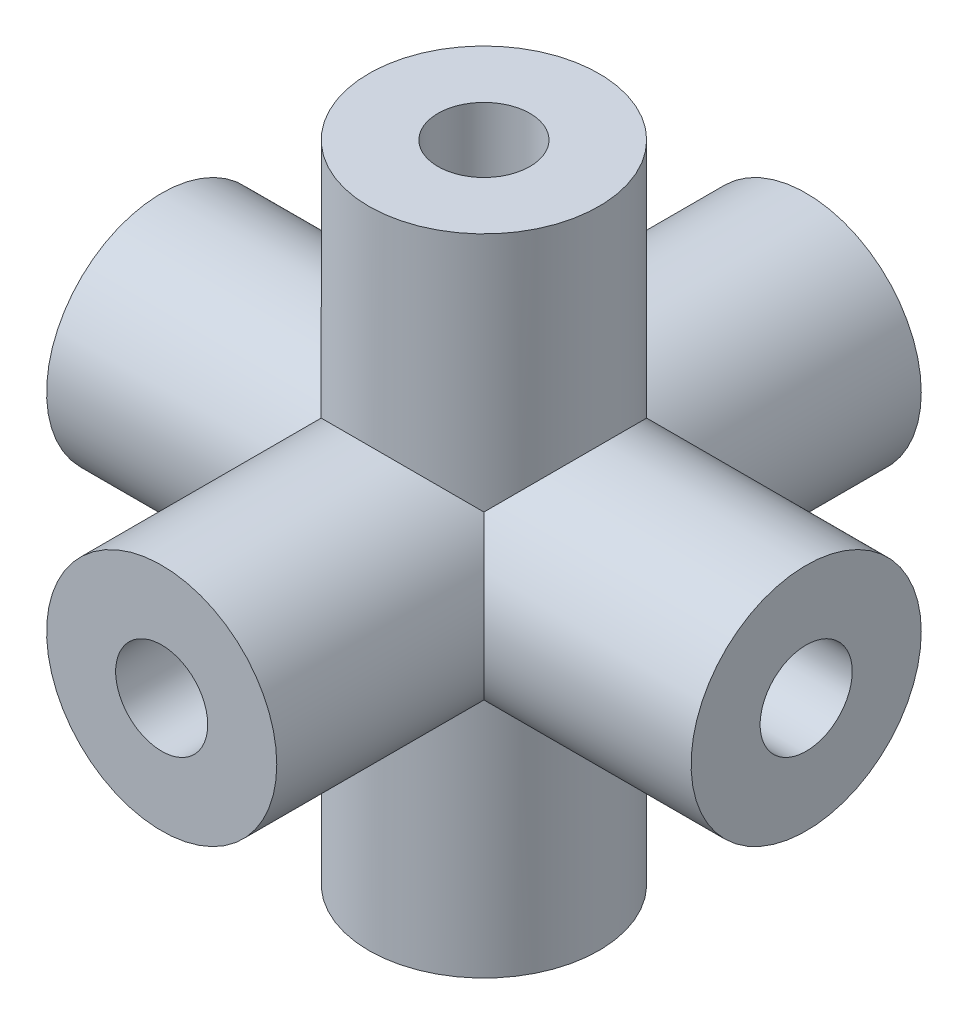
ISO-10303-21;
HEADER;
FILE_DESCRIPTION(('STEP AP214'),'2;1');
FILE_NAME('part.step','',(''),(''),'','','');
FILE_SCHEMA(('AUTOMOTIVE_DESIGN { 1 0 10303 214 1 1 1 1 }'));
ENDSEC;
DATA;
#1=APPLICATION_CONTEXT('core data for automotive mechanical design processes');
#2=APPLICATION_PROTOCOL_DEFINITION('international standard','automotive_design',2000,#1);
#3=PRODUCT_CONTEXT('',#1,'mechanical');
#4=PRODUCT('Part','Part','',(#3));
#5=PRODUCT_RELATED_PRODUCT_CATEGORY('part','',(#4));
#6=PRODUCT_DEFINITION_FORMATION('','',#4);
#7=PRODUCT_DEFINITION_CONTEXT('part definition',#1,'design');
#8=PRODUCT_DEFINITION('design','',#6,#7);
#9=PRODUCT_DEFINITION_SHAPE('','',#8);
#10=(LENGTH_UNIT() NAMED_UNIT(*) SI_UNIT(.MILLI.,.METRE.));
#11=(NAMED_UNIT(*) PLANE_ANGLE_UNIT() SI_UNIT($,.RADIAN.));
#12=(NAMED_UNIT(*) SI_UNIT($,.STERADIAN.) SOLID_ANGLE_UNIT());
#13=UNCERTAINTY_MEASURE_WITH_UNIT(LENGTH_MEASURE(1.E-05),#10,'distance_accuracy_value','');
#14=(GEOMETRIC_REPRESENTATION_CONTEXT(3) GLOBAL_UNCERTAINTY_ASSIGNED_CONTEXT((#13)) GLOBAL_UNIT_ASSIGNED_CONTEXT((#10,
#11,#12)) REPRESENTATION_CONTEXT('',''));
#15=CARTESIAN_POINT('',(0.,0.,0.));
#16=DIRECTION('',(0.,0.,1.));
#17=DIRECTION('',(1.,0.,0.));
#18=AXIS2_PLACEMENT_3D('',#15,#16,#17);
#19=CARTESIAN_POINT('',(0.,0.,7.));
#20=DIRECTION('',(0.,0.,-1.));
#21=DIRECTION('',(-1.,0.,0.));
#22=AXIS2_PLACEMENT_3D('',#19,#20,#21);
#23=CYLINDRICAL_SURFACE('',#22,2.5);
#24=CARTESIAN_POINT('',(0.,0.,7.));
#25=DIRECTION('',(0.,0.,1.));
#26=DIRECTION('',(1.,0.,0.));
#27=AXIS2_PLACEMENT_3D('',#24,#25,#26);
#28=CIRCLE('',#27,2.5);
#29=CARTESIAN_POINT('',(2.5,0.,7.));
#30=VERTEX_POINT('',#29);
#31=EDGE_CURVE('E98',#30,#30,#28,.T.);
#32=ORIENTED_EDGE('',*,*,#31,.F.);
#33=EDGE_LOOP('',(#32));
#34=FACE_BOUND('',#33,.T.);
#35=CARTESIAN_POINT('',(0.,0.,0.));
#36=DIRECTION('',(-0.707106781186547,0.,-0.707106781186547));
#37=DIRECTION('',(0.707106781186547,0.,-0.707106781186547));
#38=AXIS2_PLACEMENT_3D('',#35,#36,#37);
#39=ELLIPSE('',#38,3.53553390593274,2.5);
#40=CARTESIAN_POINT('',(-1.76776695296637,-1.76776695296637,1.76776695296637));
#41=VERTEX_POINT('',#40);
#42=CARTESIAN_POINT('',(-1.76776695296637,1.76776695296637,1.76776695296637));
#43=VERTEX_POINT('',#42);
#44=EDGE_CURVE('E51',#41,#43,#39,.T.);
#45=ORIENTED_EDGE('',*,*,#44,.F.);
#46=CARTESIAN_POINT('',(0.,0.,0.));
#47=DIRECTION('',(0.,-0.707106781186547,-0.707106781186547));
#48=DIRECTION('',(0.,0.707106781186547,-0.707106781186547));
#49=AXIS2_PLACEMENT_3D('',#46,#47,#48);
#50=ELLIPSE('',#49,3.53553390593274,2.5);
#51=CARTESIAN_POINT('',(1.76776695296637,-1.76776695296637,1.76776695296637));
#52=VERTEX_POINT('',#51);
#53=EDGE_CURVE('E82',#52,#41,#50,.T.);
#54=ORIENTED_EDGE('',*,*,#53,.F.);
#55=CARTESIAN_POINT('',(0.,0.,0.));
#56=DIRECTION('',(0.707106781186547,0.,-0.707106781186547));
#57=DIRECTION('',(-0.707106781186547,0.,-0.707106781186547));
#58=AXIS2_PLACEMENT_3D('',#55,#56,#57);
#59=ELLIPSE('',#58,3.53553390593274,2.5);
#60=CARTESIAN_POINT('',(1.76776695296637,1.76776695296637,1.76776695296637));
#61=VERTEX_POINT('',#60);
#62=EDGE_CURVE('E86',#61,#52,#59,.T.);
#63=ORIENTED_EDGE('',*,*,#62,.F.);
#64=CARTESIAN_POINT('',(0.,0.,0.));
#65=DIRECTION('',(0.,0.707106781186547,-0.707106781186547));
#66=DIRECTION('',(0.,-0.707106781186547,-0.707106781186547));
#67=AXIS2_PLACEMENT_3D('',#64,#65,#66);
#68=ELLIPSE('',#67,3.53553390593274,2.5);
#69=EDGE_CURVE('E77',#43,#61,#68,.T.);
#70=ORIENTED_EDGE('',*,*,#69,.F.);
#71=EDGE_LOOP('',(#45,#54,#63,#70));
#72=FACE_BOUND('',#71,.T.);
#73=ADVANCED_FACE('F37',(#34,#72),#23,.T.);
#74=CARTESIAN_POINT('',(0.,7.,0.));
#75=DIRECTION('',(0.,-1.,0.));
#76=DIRECTION('',(0.,0.,-1.));
#77=AXIS2_PLACEMENT_3D('',#74,#75,#76);
#78=CYLINDRICAL_SURFACE('',#77,2.5);
#79=CARTESIAN_POINT('',(0.,-7.,0.));
#80=DIRECTION('',(0.,1.,0.));
#81=DIRECTION('',(0.,0.,1.));
#82=AXIS2_PLACEMENT_3D('',#79,#80,#81);
#83=CIRCLE('',#82,2.5);
#84=CARTESIAN_POINT('',(0.,-7.,2.5));
#85=VERTEX_POINT('',#84);
#86=EDGE_CURVE('E107',#85,#85,#83,.T.);
#87=ORIENTED_EDGE('',*,*,#86,.T.);
#88=EDGE_LOOP('',(#87));
#89=FACE_BOUND('',#88,.T.);
#90=CARTESIAN_POINT('',(0.,0.,0.));
#91=DIRECTION('',(-0.707106781186547,-0.707106781186547,0.));
#92=DIRECTION('',(0.707106781186547,-0.707106781186547,0.));
#93=AXIS2_PLACEMENT_3D('',#90,#91,#92);
#94=ELLIPSE('',#93,3.53553390593274,2.5);
#95=CARTESIAN_POINT('',(1.76776695296637,-1.76776695296637,-1.76776695296637));
#96=VERTEX_POINT('',#95);
#97=EDGE_CURVE('E58',#52,#96,#94,.F.);
#98=ORIENTED_EDGE('',*,*,#97,.F.);
#99=ORIENTED_EDGE('',*,*,#53,.T.);
#100=CARTESIAN_POINT('',(0.,0.,0.));
#101=DIRECTION('',(0.707106781186547,-0.707106781186547,0.));
#102=DIRECTION('',(-0.707106781186547,-0.707106781186547,0.));
#103=AXIS2_PLACEMENT_3D('',#100,#101,#102);
#104=ELLIPSE('',#103,3.53553390593274,2.5);
#105=CARTESIAN_POINT('',(-1.76776695296637,-1.76776695296637,-1.76776695296637));
#106=VERTEX_POINT('',#105);
#107=EDGE_CURVE('E111',#106,#41,#104,.F.);
#108=ORIENTED_EDGE('',*,*,#107,.F.);
#109=CARTESIAN_POINT('',(0.,0.,0.));
#110=DIRECTION('',(0.,0.707106781186547,-0.707106781186547));
#111=DIRECTION('',(0.,-0.707106781186547,-0.707106781186547));
#112=AXIS2_PLACEMENT_3D('',#109,#110,#111);
#113=ELLIPSE('',#112,3.53553390593274,2.5);
#114=EDGE_CURVE('E83',#106,#96,#113,.F.);
#115=ORIENTED_EDGE('',*,*,#114,.T.);
#116=EDGE_LOOP('',(#98,#99,#108,#115));
#117=FACE_BOUND('',#116,.T.);
#118=ADVANCED_FACE('F175',(#89,#117),#78,.T.);
#119=CARTESIAN_POINT('',(0.,0.,-7.));
#120=DIRECTION('',(0.,0.,1.));
#121=DIRECTION('',(1.,0.,0.));
#122=AXIS2_PLACEMENT_3D('',#119,#120,#121);
#123=CIRCLE('',#122,2.5);
#124=CARTESIAN_POINT('',(2.5,0.,-7.));
#125=VERTEX_POINT('',#124);
#126=EDGE_CURVE('E101',#125,#125,#123,.T.);
#127=ORIENTED_EDGE('',*,*,#126,.T.);
#128=EDGE_LOOP('',(#127));
#129=FACE_BOUND('',#128,.T.);
#130=CARTESIAN_POINT('',(0.,0.,0.));
#131=DIRECTION('',(-0.707106781186547,0.,-0.707106781186547));
#132=DIRECTION('',(0.707106781186547,0.,-0.707106781186547));
#133=AXIS2_PLACEMENT_3D('',#130,#131,#132);
#134=ELLIPSE('',#133,3.53553390593274,2.5);
#135=CARTESIAN_POINT('',(1.76776695296637,1.76776695296637,-1.76776695296637));
#136=VERTEX_POINT('',#135);
#137=EDGE_CURVE('E92',#96,#136,#134,.F.);
#138=ORIENTED_EDGE('',*,*,#137,.F.);
#139=ORIENTED_EDGE('',*,*,#114,.F.);
#140=CARTESIAN_POINT('',(0.,0.,0.));
#141=DIRECTION('',(0.707106781186547,0.,-0.707106781186547));
#142=DIRECTION('',(-0.707106781186547,0.,-0.707106781186547));
#143=AXIS2_PLACEMENT_3D('',#140,#141,#142);
#144=ELLIPSE('',#143,3.53553390593274,2.5);
#145=CARTESIAN_POINT('',(-1.76776695296637,1.76776695296637,-1.76776695296637));
#146=VERTEX_POINT('',#145);
#147=EDGE_CURVE('E88',#146,#106,#144,.F.);
#148=ORIENTED_EDGE('',*,*,#147,.F.);
#149=CARTESIAN_POINT('',(0.,0.,0.));
#150=DIRECTION('',(0.,-0.707106781186547,-0.707106781186547));
#151=DIRECTION('',(0.,0.707106781186547,-0.707106781186547));
#152=AXIS2_PLACEMENT_3D('',#149,#150,#151);
#153=ELLIPSE('',#152,3.53553390593274,2.5);
#154=EDGE_CURVE('E93',#136,#146,#153,.F.);
#155=ORIENTED_EDGE('',*,*,#154,.F.);
#156=EDGE_LOOP('',(#138,#139,#148,#155));
#157=FACE_BOUND('',#156,.T.);
#158=ADVANCED_FACE('F173',(#129,#157),#23,.T.);
#159=CARTESIAN_POINT('',(0.,7.,0.));
#160=DIRECTION('',(0.,1.,0.));
#161=DIRECTION('',(0.,0.,1.));
#162=AXIS2_PLACEMENT_3D('',#159,#160,#161);
#163=CIRCLE('',#162,2.5);
#164=CARTESIAN_POINT('',(0.,7.,2.5));
#165=VERTEX_POINT('',#164);
#166=EDGE_CURVE('E104',#165,#165,#163,.T.);
#167=ORIENTED_EDGE('',*,*,#166,.F.);
#168=EDGE_LOOP('',(#167));
#169=FACE_BOUND('',#168,.T.);
#170=CARTESIAN_POINT('',(0.,0.,0.));
#171=DIRECTION('',(-0.707106781186547,-0.707106781186547,0.));
#172=DIRECTION('',(0.707106781186547,-0.707106781186547,0.));
#173=AXIS2_PLACEMENT_3D('',#170,#171,#172);
#174=ELLIPSE('',#173,3.53553390593274,2.5);
#175=EDGE_CURVE('E11',#43,#146,#174,.T.);
#176=ORIENTED_EDGE('',*,*,#175,.F.);
#177=ORIENTED_EDGE('',*,*,#69,.T.);
#178=CARTESIAN_POINT('',(0.,0.,0.));
#179=DIRECTION('',(0.707106781186547,-0.707106781186547,0.));
#180=DIRECTION('',(-0.707106781186547,-0.707106781186547,0.));
#181=AXIS2_PLACEMENT_3D('',#178,#179,#180);
#182=ELLIPSE('',#181,3.53553390593274,2.5);
#183=EDGE_CURVE('E44',#136,#61,#182,.T.);
#184=ORIENTED_EDGE('',*,*,#183,.F.);
#185=ORIENTED_EDGE('',*,*,#154,.T.);
#186=EDGE_LOOP('',(#176,#177,#184,#185));
#187=FACE_BOUND('',#186,.T.);
#188=ADVANCED_FACE('F79',(#169,#187),#78,.T.);
#189=CARTESIAN_POINT('',(0.,0.,7.));
#190=DIRECTION('',(0.,0.,1.));
#191=DIRECTION('',(1.,0.,0.));
#192=AXIS2_PLACEMENT_3D('',#189,#190,#191);
#193=PLANE('',#192);
#194=CARTESIAN_POINT('',(0.,0.,7.));
#195=DIRECTION('',(0.,0.,1.));
#196=DIRECTION('',(1.,0.,0.));
#197=AXIS2_PLACEMENT_3D('',#194,#195,#196);
#198=CIRCLE('',#197,1.);
#199=CARTESIAN_POINT('',(0.999999999999975,0.,7.));
#200=VERTEX_POINT('',#199);
#201=EDGE_CURVE('E133',#200,#200,#198,.T.);
#202=ORIENTED_EDGE('',*,*,#201,.F.);
#203=EDGE_LOOP('',(#202));
#204=FACE_BOUND('',#203,.T.);
#205=ORIENTED_EDGE('',*,*,#31,.T.);
#206=EDGE_LOOP('',(#205));
#207=FACE_BOUND('',#206,.T.);
#208=ADVANCED_FACE('F172',(#204,#207),#193,.T.);
#209=CARTESIAN_POINT('',(0.,-7.,0.));
#210=DIRECTION('',(0.,1.,0.));
#211=DIRECTION('',(0.,0.,1.));
#212=AXIS2_PLACEMENT_3D('',#209,#210,#211);
#213=PLANE('',#212);
#214=CARTESIAN_POINT('',(0.,-7.,0.));
#215=DIRECTION('',(0.,-1.,0.));
#216=DIRECTION('',(0.,0.,-1.));
#217=AXIS2_PLACEMENT_3D('',#214,#215,#216);
#218=CIRCLE('',#217,1.);
#219=CARTESIAN_POINT('',(0.,-6.99999999999999,-1.00000000000007));
#220=VERTEX_POINT('',#219);
#221=EDGE_CURVE('E151',#220,#220,#218,.T.);
#222=ORIENTED_EDGE('',*,*,#221,.F.);
#223=EDGE_LOOP('',(#222));
#224=FACE_BOUND('',#223,.T.);
#225=ORIENTED_EDGE('',*,*,#86,.F.);
#226=EDGE_LOOP('',(#225));
#227=FACE_BOUND('',#226,.T.);
#228=ADVANCED_FACE('F180',(#224,#227),#213,.F.);
#229=CARTESIAN_POINT('',(0.,0.,-7.));
#230=DIRECTION('',(0.,0.,1.));
#231=DIRECTION('',(1.,0.,0.));
#232=AXIS2_PLACEMENT_3D('',#229,#230,#231);
#233=PLANE('',#232);
#234=CARTESIAN_POINT('',(0.,0.,-7.));
#235=DIRECTION('',(0.,0.,-1.));
#236=DIRECTION('',(-1.,0.,0.));
#237=AXIS2_PLACEMENT_3D('',#234,#235,#236);
#238=CIRCLE('',#237,1.);
#239=CARTESIAN_POINT('',(-0.999999999999927,0.,-7.00000000000001));
#240=VERTEX_POINT('',#239);
#241=EDGE_CURVE('E145',#240,#240,#238,.T.);
#242=ORIENTED_EDGE('',*,*,#241,.F.);
#243=EDGE_LOOP('',(#242));
#244=FACE_BOUND('',#243,.T.);
#245=ORIENTED_EDGE('',*,*,#126,.F.);
#246=EDGE_LOOP('',(#245));
#247=FACE_BOUND('',#246,.T.);
#248=ADVANCED_FACE('F167',(#244,#247),#233,.F.);
#249=CARTESIAN_POINT('',(0.,7.,0.));
#250=DIRECTION('',(0.,1.,0.));
#251=DIRECTION('',(0.,0.,1.));
#252=AXIS2_PLACEMENT_3D('',#249,#250,#251);
#253=PLANE('',#252);
#254=CARTESIAN_POINT('',(0.,7.,0.));
#255=DIRECTION('',(0.,1.,0.));
#256=DIRECTION('',(0.,0.,-1.));
#257=AXIS2_PLACEMENT_3D('',#254,#255,#256);
#258=CIRCLE('',#257,1.);
#259=CARTESIAN_POINT('',(0.,6.99999999999999,-1.00000000000007));
#260=VERTEX_POINT('',#259);
#261=EDGE_CURVE('E157',#260,#260,#258,.T.);
#262=ORIENTED_EDGE('',*,*,#261,.F.);
#263=EDGE_LOOP('',(#262));
#264=FACE_BOUND('',#263,.T.);
#265=ORIENTED_EDGE('',*,*,#166,.T.);
#266=EDGE_LOOP('',(#265));
#267=FACE_BOUND('',#266,.T.);
#268=ADVANCED_FACE('F163',(#264,#267),#253,.T.);
#269=CARTESIAN_POINT('',(7.,0.,0.));
#270=DIRECTION('',(1.,0.,0.));
#271=DIRECTION('',(0.,0.,-1.));
#272=AXIS2_PLACEMENT_3D('',#269,#270,#271);
#273=PLANE('',#272);
#274=CARTESIAN_POINT('',(7.,0.,0.));
#275=DIRECTION('',(1.,0.,0.));
#276=DIRECTION('',(0.,0.,-1.));
#277=AXIS2_PLACEMENT_3D('',#274,#275,#276);
#278=CIRCLE('',#277,1.);
#279=CARTESIAN_POINT('',(7.,0.,-1.));
#280=VERTEX_POINT('',#279);
#281=EDGE_CURVE('E127',#280,#280,#278,.T.);
#282=ORIENTED_EDGE('',*,*,#281,.F.);
#283=EDGE_LOOP('',(#282));
#284=FACE_BOUND('',#283,.T.);
#285=CARTESIAN_POINT('',(7.,0.,0.));
#286=DIRECTION('',(1.,0.,0.));
#287=DIRECTION('',(0.,0.,-1.));
#288=AXIS2_PLACEMENT_3D('',#285,#286,#287);
#289=CIRCLE('',#288,2.5);
#290=CARTESIAN_POINT('',(7.,0.,-2.5));
#291=VERTEX_POINT('',#290);
#292=EDGE_CURVE('E118',#291,#291,#289,.T.);
#293=ORIENTED_EDGE('',*,*,#292,.T.);
#294=EDGE_LOOP('',(#293));
#295=FACE_BOUND('',#294,.T.);
#296=ADVANCED_FACE('F166',(#284,#295),#273,.T.);
#297=CARTESIAN_POINT('',(7.,0.,0.));
#298=DIRECTION('',(-1.,0.,0.));
#299=DIRECTION('',(0.,0.,1.));
#300=AXIS2_PLACEMENT_3D('',#297,#298,#299);
#301=CYLINDRICAL_SURFACE('',#300,2.5);
#302=ORIENTED_EDGE('',*,*,#292,.F.);
#303=EDGE_LOOP('',(#302));
#304=FACE_BOUND('',#303,.T.);
#305=ORIENTED_EDGE('',*,*,#183,.T.);
#306=ORIENTED_EDGE('',*,*,#62,.T.);
#307=ORIENTED_EDGE('',*,*,#97,.T.);
#308=ORIENTED_EDGE('',*,*,#137,.T.);
#309=EDGE_LOOP('',(#305,#306,#307,#308));
#310=FACE_BOUND('',#309,.T.);
#311=ADVANCED_FACE('F91',(#304,#310),#301,.T.);
#312=CARTESIAN_POINT('',(-7.,0.,0.));
#313=DIRECTION('',(1.,0.,0.));
#314=DIRECTION('',(0.,0.,-1.));
#315=AXIS2_PLACEMENT_3D('',#312,#313,#314);
#316=CIRCLE('',#315,2.5);
#317=CARTESIAN_POINT('',(-7.,0.,-2.5));
#318=VERTEX_POINT('',#317);
#319=EDGE_CURVE('E121',#318,#318,#316,.T.);
#320=ORIENTED_EDGE('',*,*,#319,.T.);
#321=EDGE_LOOP('',(#320));
#322=FACE_BOUND('',#321,.T.);
#323=ORIENTED_EDGE('',*,*,#107,.T.);
#324=ORIENTED_EDGE('',*,*,#44,.T.);
#325=ORIENTED_EDGE('',*,*,#175,.T.);
#326=ORIENTED_EDGE('',*,*,#147,.T.);
#327=EDGE_LOOP('',(#323,#324,#325,#326));
#328=FACE_BOUND('',#327,.T.);
#329=ADVANCED_FACE('F251',(#322,#328),#301,.T.);
#330=CARTESIAN_POINT('',(-7.,0.,0.));
#331=DIRECTION('',(1.,0.,0.));
#332=DIRECTION('',(0.,0.,-1.));
#333=AXIS2_PLACEMENT_3D('',#330,#331,#332);
#334=PLANE('',#333);
#335=CARTESIAN_POINT('',(-7.,0.,0.));
#336=DIRECTION('',(-1.,0.,0.));
#337=DIRECTION('',(0.,0.,1.));
#338=AXIS2_PLACEMENT_3D('',#335,#336,#337);
#339=CIRCLE('',#338,1.);
#340=CARTESIAN_POINT('',(-7.00000000000001,0.,0.999999999999951));
#341=VERTEX_POINT('',#340);
#342=EDGE_CURVE('E139',#341,#341,#339,.T.);
#343=ORIENTED_EDGE('',*,*,#342,.F.);
#344=EDGE_LOOP('',(#343));
#345=FACE_BOUND('',#344,.T.);
#346=ORIENTED_EDGE('',*,*,#319,.F.);
#347=EDGE_LOOP('',(#346));
#348=FACE_BOUND('',#347,.T.);
#349=ADVANCED_FACE('F261',(#345,#348),#334,.F.);
#350=CARTESIAN_POINT('',(4.,0.,0.));
#351=DIRECTION('',(1.,0.,0.));
#352=DIRECTION('',(0.,0.,-1.));
#353=AXIS2_PLACEMENT_3D('',#350,#351,#352);
#354=CYLINDRICAL_SURFACE('',#353,1.);
#355=CARTESIAN_POINT('',(4.,0.,0.));
#356=DIRECTION('',(1.,0.,0.));
#357=DIRECTION('',(0.,0.,-1.));
#358=AXIS2_PLACEMENT_3D('',#355,#356,#357);
#359=CIRCLE('',#358,1.);
#360=CARTESIAN_POINT('',(4.,0.,-1.));
#361=VERTEX_POINT('',#360);
#362=EDGE_CURVE('E124',#361,#361,#359,.T.);
#363=ORIENTED_EDGE('',*,*,#362,.F.);
#364=EDGE_LOOP('',(#363));
#365=FACE_BOUND('',#364,.T.);
#366=ORIENTED_EDGE('',*,*,#281,.T.);
#367=EDGE_LOOP('',(#366));
#368=FACE_BOUND('',#367,.T.);
#369=ADVANCED_FACE('F270',(#365,#368),#354,.F.);
#370=CARTESIAN_POINT('',(4.,0.,0.));
#371=DIRECTION('',(1.,0.,0.));
#372=DIRECTION('',(0.,0.,-1.));
#373=AXIS2_PLACEMENT_3D('',#370,#371,#372);
#374=PLANE('',#373);
#375=ORIENTED_EDGE('',*,*,#362,.T.);
#376=EDGE_LOOP('',(#375));
#377=FACE_BOUND('',#376,.T.);
#378=ADVANCED_FACE('F280',(#377),#374,.T.);
#379=CARTESIAN_POINT('',(0.,0.,4.));
#380=DIRECTION('',(0.,0.,1.));
#381=DIRECTION('',(1.,0.,0.));
#382=AXIS2_PLACEMENT_3D('',#379,#380,#381);
#383=CYLINDRICAL_SURFACE('',#382,1.);
#384=CARTESIAN_POINT('',(0.,0.,4.));
#385=DIRECTION('',(0.,0.,1.));
#386=DIRECTION('',(1.,0.,0.));
#387=AXIS2_PLACEMENT_3D('',#384,#385,#386);
#388=CIRCLE('',#387,1.);
#389=CARTESIAN_POINT('',(0.999999999999975,0.,4.00000000000001));
#390=VERTEX_POINT('',#389);
#391=EDGE_CURVE('E130',#390,#390,#388,.T.);
#392=ORIENTED_EDGE('',*,*,#391,.F.);
#393=EDGE_LOOP('',(#392));
#394=FACE_BOUND('',#393,.T.);
#395=ORIENTED_EDGE('',*,*,#201,.T.);
#396=EDGE_LOOP('',(#395));
#397=FACE_BOUND('',#396,.T.);
#398=ADVANCED_FACE('F290',(#394,#397),#383,.F.);
#399=CARTESIAN_POINT('',(0.,0.,4.));
#400=DIRECTION('',(0.,0.,1.));
#401=DIRECTION('',(1.,0.,0.));
#402=AXIS2_PLACEMENT_3D('',#399,#400,#401);
#403=PLANE('',#402);
#404=ORIENTED_EDGE('',*,*,#391,.T.);
#405=EDGE_LOOP('',(#404));
#406=FACE_BOUND('',#405,.T.);
#407=ADVANCED_FACE('F300',(#406),#403,.T.);
#408=CARTESIAN_POINT('',(-4.,0.,0.));
#409=DIRECTION('',(-1.,0.,0.));
#410=DIRECTION('',(0.,0.,1.));
#411=AXIS2_PLACEMENT_3D('',#408,#409,#410);
#412=CYLINDRICAL_SURFACE('',#411,1.);
#413=CARTESIAN_POINT('',(-4.,0.,0.));
#414=DIRECTION('',(-1.,0.,0.));
#415=DIRECTION('',(0.,0.,1.));
#416=AXIS2_PLACEMENT_3D('',#413,#414,#415);
#417=CIRCLE('',#416,1.);
#418=CARTESIAN_POINT('',(-4.00000000000001,0.,0.999999999999972));
#419=VERTEX_POINT('',#418);
#420=EDGE_CURVE('E136',#419,#419,#417,.T.);
#421=ORIENTED_EDGE('',*,*,#420,.F.);
#422=EDGE_LOOP('',(#421));
#423=FACE_BOUND('',#422,.T.);
#424=ORIENTED_EDGE('',*,*,#342,.T.);
#425=EDGE_LOOP('',(#424));
#426=FACE_BOUND('',#425,.T.);
#427=ADVANCED_FACE('F310',(#423,#426),#412,.F.);
#428=CARTESIAN_POINT('',(-4.,0.,0.));
#429=DIRECTION('',(-1.,0.,0.));
#430=DIRECTION('',(0.,0.,1.));
#431=AXIS2_PLACEMENT_3D('',#428,#429,#430);
#432=PLANE('',#431);
#433=ORIENTED_EDGE('',*,*,#420,.T.);
#434=EDGE_LOOP('',(#433));
#435=FACE_BOUND('',#434,.T.);
#436=ADVANCED_FACE('F320',(#435),#432,.T.);
#437=CARTESIAN_POINT('',(0.,0.,-4.));
#438=DIRECTION('',(0.,0.,-1.));
#439=DIRECTION('',(-1.,0.,0.));
#440=AXIS2_PLACEMENT_3D('',#437,#438,#439);
#441=CYLINDRICAL_SURFACE('',#440,1.);
#442=CARTESIAN_POINT('',(0.,0.,-4.));
#443=DIRECTION('',(0.,0.,-1.));
#444=DIRECTION('',(-1.,0.,0.));
#445=AXIS2_PLACEMENT_3D('',#442,#443,#444);
#446=CIRCLE('',#445,1.);
#447=CARTESIAN_POINT('',(-0.999999999999958,0.,-4.00000000000001));
#448=VERTEX_POINT('',#447);
#449=EDGE_CURVE('E142',#448,#448,#446,.T.);
#450=ORIENTED_EDGE('',*,*,#449,.F.);
#451=EDGE_LOOP('',(#450));
#452=FACE_BOUND('',#451,.T.);
#453=ORIENTED_EDGE('',*,*,#241,.T.);
#454=EDGE_LOOP('',(#453));
#455=FACE_BOUND('',#454,.T.);
#456=ADVANCED_FACE('F330',(#452,#455),#441,.F.);
#457=CARTESIAN_POINT('',(0.,0.,-4.));
#458=DIRECTION('',(0.,0.,-1.));
#459=DIRECTION('',(-1.,0.,0.));
#460=AXIS2_PLACEMENT_3D('',#457,#458,#459);
#461=PLANE('',#460);
#462=ORIENTED_EDGE('',*,*,#449,.T.);
#463=EDGE_LOOP('',(#462));
#464=FACE_BOUND('',#463,.T.);
#465=ADVANCED_FACE('F340',(#464),#461,.T.);
#466=CARTESIAN_POINT('',(0.,-4.,0.));
#467=DIRECTION('',(0.,-1.,0.));
#468=DIRECTION('',(0.,0.,-1.));
#469=AXIS2_PLACEMENT_3D('',#466,#467,#468);
#470=CYLINDRICAL_SURFACE('',#469,1.);
#471=CARTESIAN_POINT('',(0.,-4.,0.));
#472=DIRECTION('',(0.,-1.,0.));
#473=DIRECTION('',(0.,0.,-1.));
#474=AXIS2_PLACEMENT_3D('',#471,#472,#473);
#475=CIRCLE('',#474,1.);
#476=CARTESIAN_POINT('',(0.,-3.99999999999999,-1.00000000000004));
#477=VERTEX_POINT('',#476);
#478=EDGE_CURVE('E148',#477,#477,#475,.T.);
#479=ORIENTED_EDGE('',*,*,#478,.F.);
#480=EDGE_LOOP('',(#479));
#481=FACE_BOUND('',#480,.T.);
#482=ORIENTED_EDGE('',*,*,#221,.T.);
#483=EDGE_LOOP('',(#482));
#484=FACE_BOUND('',#483,.T.);
#485=ADVANCED_FACE('F350',(#481,#484),#470,.F.);
#486=CARTESIAN_POINT('',(0.,-4.,0.));
#487=DIRECTION('',(0.,-1.,0.));
#488=DIRECTION('',(0.,0.,-1.));
#489=AXIS2_PLACEMENT_3D('',#486,#487,#488);
#490=PLANE('',#489);
#491=ORIENTED_EDGE('',*,*,#478,.T.);
#492=EDGE_LOOP('',(#491));
#493=FACE_BOUND('',#492,.T.);
#494=ADVANCED_FACE('F360',(#493),#490,.T.);
#495=CARTESIAN_POINT('',(0.,4.,0.));
#496=DIRECTION('',(0.,1.,0.));
#497=DIRECTION('',(-1.,0.,0.));
#498=AXIS2_PLACEMENT_3D('',#495,#496,#497);
#499=CYLINDRICAL_SURFACE('',#498,1.);
#500=CARTESIAN_POINT('',(0.,4.,0.));
#501=DIRECTION('',(0.,1.,0.));
#502=DIRECTION('',(0.,0.,-1.));
#503=AXIS2_PLACEMENT_3D('',#500,#501,#502);
#504=CIRCLE('',#503,1.);
#505=CARTESIAN_POINT('',(0.,3.99999999999999,-1.00000000000004));
#506=VERTEX_POINT('',#505);
#507=EDGE_CURVE('E154',#506,#506,#504,.T.);
#508=ORIENTED_EDGE('',*,*,#507,.F.);
#509=EDGE_LOOP('',(#508));
#510=FACE_BOUND('',#509,.T.);
#511=ORIENTED_EDGE('',*,*,#261,.T.);
#512=EDGE_LOOP('',(#511));
#513=FACE_BOUND('',#512,.T.);
#514=ADVANCED_FACE('F161',(#510,#513),#499,.F.);
#515=CARTESIAN_POINT('',(0.,4.,0.));
#516=DIRECTION('',(0.,1.,0.));
#517=DIRECTION('',(0.,0.,-1.));
#518=AXIS2_PLACEMENT_3D('',#515,#516,#517);
#519=PLANE('',#518);
#520=ORIENTED_EDGE('',*,*,#507,.T.);
#521=EDGE_LOOP('',(#520));
#522=FACE_BOUND('',#521,.T.);
#523=ADVANCED_FACE('F379',(#522),#519,.T.);
#524=CLOSED_SHELL('',(#73,#118,#158,#188,#208,#228,#248,#268,#296,#311,#329,#349,#369,#378,#398,
#407,#427,#436,#456,#465,#485,#494,#514,#523));
#525=MANIFOLD_SOLID_BREP('B2',#524);
#526=ADVANCED_BREP_SHAPE_REPRESENTATION('',(#18,#525),#14);
#527=SHAPE_DEFINITION_REPRESENTATION(#9,#526);
ENDSEC;
END-ISO-10303-21;
